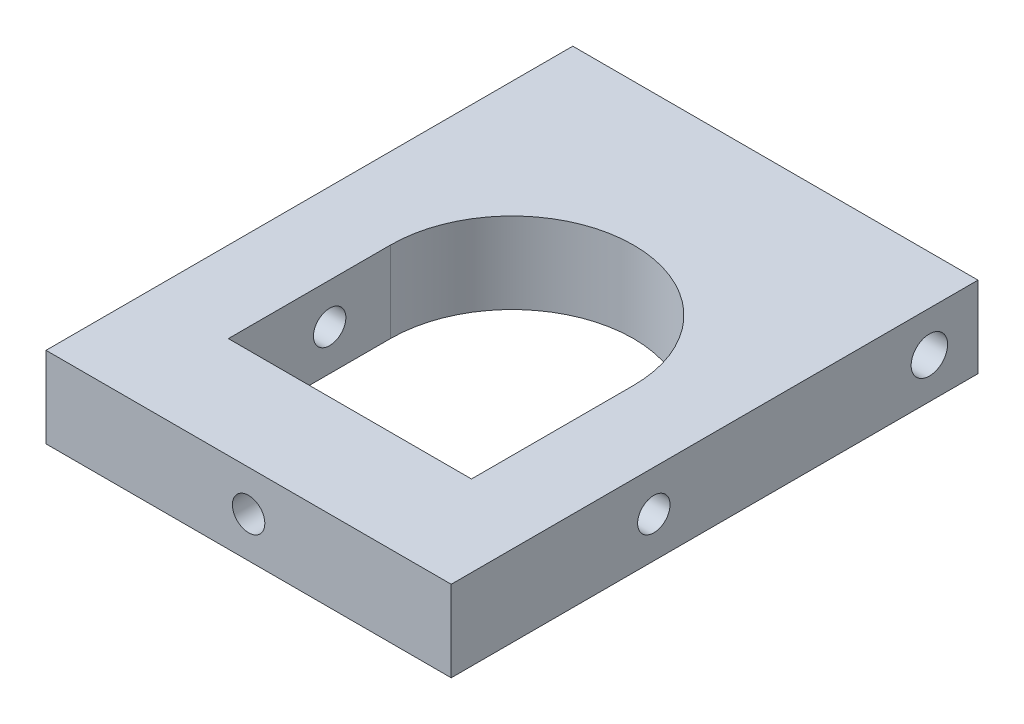
ISO-10303-21;
HEADER;
FILE_DESCRIPTION(('STEP AP214'),'2;1');
FILE_NAME('part.step','',(''),(''),'','','');
FILE_SCHEMA(('AUTOMOTIVE_DESIGN { 1 0 10303 214 1 1 1 1 }'));
ENDSEC;
DATA;
#1=APPLICATION_CONTEXT('core data for automotive mechanical design processes');
#2=APPLICATION_PROTOCOL_DEFINITION('international standard','automotive_design',2000,#1);
#3=PRODUCT_CONTEXT('',#1,'mechanical');
#4=PRODUCT('Part','Part','',(#3));
#5=PRODUCT_RELATED_PRODUCT_CATEGORY('part','',(#4));
#6=PRODUCT_DEFINITION_FORMATION('','',#4);
#7=PRODUCT_DEFINITION_CONTEXT('part definition',#1,'design');
#8=PRODUCT_DEFINITION('design','',#6,#7);
#9=PRODUCT_DEFINITION_SHAPE('','',#8);
#10=(LENGTH_UNIT() NAMED_UNIT(*) SI_UNIT(.MILLI.,.METRE.));
#11=(NAMED_UNIT(*) PLANE_ANGLE_UNIT() SI_UNIT($,.RADIAN.));
#12=(NAMED_UNIT(*) SI_UNIT($,.STERADIAN.) SOLID_ANGLE_UNIT());
#13=UNCERTAINTY_MEASURE_WITH_UNIT(LENGTH_MEASURE(1.E-05),#10,'distance_accuracy_value','');
#14=(GEOMETRIC_REPRESENTATION_CONTEXT(3) GLOBAL_UNCERTAINTY_ASSIGNED_CONTEXT((#13)) GLOBAL_UNIT_ASSIGNED_CONTEXT((#10,
#11,#12)) REPRESENTATION_CONTEXT('',''));
#15=CARTESIAN_POINT('',(0.,0.,0.));
#16=DIRECTION('',(0.,0.,1.));
#17=DIRECTION('',(1.,0.,0.));
#18=AXIS2_PLACEMENT_3D('',#15,#16,#17);
#19=CARTESIAN_POINT('',(0.,0.,0.));
#20=DIRECTION('',(0.,1.,0.));
#21=DIRECTION('',(0.,0.,1.));
#22=AXIS2_PLACEMENT_3D('',#19,#20,#21);
#23=PLANE('',#22);
#24=DIRECTION('',(0.,0.,1.));
#25=VECTOR('',#24,1.);
#26=CARTESIAN_POINT('',(-21.35,0.,3.74999999999999));
#27=LINE('',#26,#25);
#28=CARTESIAN_POINT('',(-21.35,0.,3.74999999999999));
#29=VERTEX_POINT('',#28);
#30=CARTESIAN_POINT('',(-21.35,0.,11.25));
#31=VERTEX_POINT('',#30);
#32=EDGE_CURVE('E57',#29,#31,#27,.T.);
#33=ORIENTED_EDGE('',*,*,#32,.T.);
#34=DIRECTION('',(1.,0.,0.));
#35=VECTOR('',#34,1.);
#36=CARTESIAN_POINT('',(-18.65,0.,11.25));
#37=LINE('',#36,#35);
#38=CARTESIAN_POINT('',(-18.65,0.,11.25));
#39=VERTEX_POINT('',#38);
#40=EDGE_CURVE('E213',#31,#39,#37,.T.);
#41=ORIENTED_EDGE('',*,*,#40,.T.);
#42=DIRECTION('',(0.,0.,-1.));
#43=VECTOR('',#42,1.);
#44=CARTESIAN_POINT('',(-18.65,0.,3.74999999999999));
#45=LINE('',#44,#43);
#46=CARTESIAN_POINT('',(-18.65,0.,3.74999999999999));
#47=VERTEX_POINT('',#46);
#48=EDGE_CURVE('E216',#39,#47,#45,.T.);
#49=ORIENTED_EDGE('',*,*,#48,.T.);
#50=DIRECTION('',(-1.,0.,0.));
#51=VECTOR('',#50,1.);
#52=CARTESIAN_POINT('',(-18.65,0.,3.74999999999999));
#53=LINE('',#52,#51);
#54=EDGE_CURVE('E205',#47,#29,#53,.T.);
#55=ORIENTED_EDGE('',*,*,#54,.T.);
#56=EDGE_LOOP('',(#33,#41,#49,#55));
#57=FACE_BOUND('',#56,.T.);
#58=CARTESIAN_POINT('',(0.,0.,0.));
#59=DIRECTION('',(0.,1.,0.));
#60=DIRECTION('',(0.,0.,1.));
#61=AXIS2_PLACEMENT_3D('',#58,#59,#60);
#62=CIRCLE('',#61,15.);
#63=CARTESIAN_POINT('',(15.,0.,0.));
#64=VERTEX_POINT('',#63);
#65=CARTESIAN_POINT('',(-15.,0.,0.));
#66=VERTEX_POINT('',#65);
#67=EDGE_CURVE('E283',#64,#66,#62,.T.);
#68=ORIENTED_EDGE('',*,*,#67,.T.);
#69=DIRECTION('',(0.,0.,1.));
#70=VECTOR('',#69,1.);
#71=CARTESIAN_POINT('',(-15.,0.,0.));
#72=LINE('',#71,#70);
#73=CARTESIAN_POINT('',(-15.,0.,20.));
#74=VERTEX_POINT('',#73);
#75=EDGE_CURVE('E297',#66,#74,#72,.T.);
#76=ORIENTED_EDGE('',*,*,#75,.T.);
#77=DIRECTION('',(1.,0.,0.));
#78=VECTOR('',#77,1.);
#79=CARTESIAN_POINT('',(-15.,0.,20.));
#80=LINE('',#79,#78);
#81=CARTESIAN_POINT('',(15.,0.,20.));
#82=VERTEX_POINT('',#81);
#83=EDGE_CURVE('E300',#74,#82,#80,.T.);
#84=ORIENTED_EDGE('',*,*,#83,.T.);
#85=DIRECTION('',(0.,0.,-1.));
#86=VECTOR('',#85,1.);
#87=CARTESIAN_POINT('',(15.,0.,20.));
#88=LINE('',#87,#86);
#89=EDGE_CURVE('E287',#82,#64,#88,.T.);
#90=ORIENTED_EDGE('',*,*,#89,.T.);
#91=EDGE_LOOP('',(#68,#76,#84,#90));
#92=FACE_BOUND('',#91,.T.);
#93=DIRECTION('',(0.,0.,-1.));
#94=VECTOR('',#93,1.);
#95=CARTESIAN_POINT('',(25.,0.,-32.5));
#96=LINE('',#95,#94);
#97=CARTESIAN_POINT('',(25.,0.,32.5));
#98=VERTEX_POINT('',#97);
#99=CARTESIAN_POINT('',(25.,0.,-32.5));
#100=VERTEX_POINT('',#99);
#101=EDGE_CURVE('E314',#98,#100,#96,.T.);
#102=ORIENTED_EDGE('',*,*,#101,.F.);
#103=DIRECTION('',(1.,0.,0.));
#104=VECTOR('',#103,1.);
#105=CARTESIAN_POINT('',(-25.,0.,32.5));
#106=LINE('',#105,#104);
#107=CARTESIAN_POINT('',(-25.,0.,32.5));
#108=VERTEX_POINT('',#107);
#109=EDGE_CURVE('E319',#108,#98,#106,.T.);
#110=ORIENTED_EDGE('',*,*,#109,.F.);
#111=DIRECTION('',(0.,0.,1.));
#112=VECTOR('',#111,1.);
#113=CARTESIAN_POINT('',(-25.,0.,-32.5));
#114=LINE('',#113,#112);
#115=CARTESIAN_POINT('',(-25.,0.,-32.5));
#116=VERTEX_POINT('',#115);
#117=EDGE_CURVE('E330',#116,#108,#114,.T.);
#118=ORIENTED_EDGE('',*,*,#117,.F.);
#119=DIRECTION('',(-1.,0.,0.));
#120=VECTOR('',#119,1.);
#121=CARTESIAN_POINT('',(-25.,0.,-32.5));
#122=LINE('',#121,#120);
#123=EDGE_CURVE('E328',#100,#116,#122,.T.);
#124=ORIENTED_EDGE('',*,*,#123,.F.);
#125=EDGE_LOOP('',(#102,#110,#118,#124));
#126=FACE_BOUND('',#125,.T.);
#127=DIRECTION('',(0.,0.,1.));
#128=VECTOR('',#127,1.);
#129=CARTESIAN_POINT('',(18.65,0.,3.74999999999999));
#130=LINE('',#129,#128);
#131=CARTESIAN_POINT('',(18.65,0.,3.74999999999999));
#132=VERTEX_POINT('',#131);
#133=CARTESIAN_POINT('',(18.65,0.,11.25));
#134=VERTEX_POINT('',#133);
#135=EDGE_CURVE('E240',#132,#134,#130,.T.);
#136=ORIENTED_EDGE('',*,*,#135,.T.);
#137=DIRECTION('',(1.,0.,0.));
#138=VECTOR('',#137,1.);
#139=CARTESIAN_POINT('',(21.35,0.,11.25));
#140=LINE('',#139,#138);
#141=CARTESIAN_POINT('',(21.35,0.,11.25));
#142=VERTEX_POINT('',#141);
#143=EDGE_CURVE('E243',#134,#142,#140,.T.);
#144=ORIENTED_EDGE('',*,*,#143,.T.);
#145=DIRECTION('',(0.,0.,-1.));
#146=VECTOR('',#145,1.);
#147=CARTESIAN_POINT('',(21.35,0.,3.74999999999999));
#148=LINE('',#147,#146);
#149=CARTESIAN_POINT('',(21.35,0.,3.74999999999999));
#150=VERTEX_POINT('',#149);
#151=EDGE_CURVE('E247',#142,#150,#148,.T.);
#152=ORIENTED_EDGE('',*,*,#151,.T.);
#153=DIRECTION('',(-1.,0.,0.));
#154=VECTOR('',#153,1.);
#155=CARTESIAN_POINT('',(21.35,0.,3.74999999999999));
#156=LINE('',#155,#154);
#157=EDGE_CURVE('E233',#150,#132,#156,.T.);
#158=ORIENTED_EDGE('',*,*,#157,.T.);
#159=EDGE_LOOP('',(#136,#144,#152,#158));
#160=FACE_BOUND('',#159,.T.);
#161=DIRECTION('',(0.,0.,1.));
#162=VECTOR('',#161,1.);
#163=CARTESIAN_POINT('',(-3.75000000000001,0.,24.9));
#164=LINE('',#163,#162);
#165=CARTESIAN_POINT('',(-3.75000000000001,0.,24.9));
#166=VERTEX_POINT('',#165);
#167=CARTESIAN_POINT('',(-3.75000000000001,0.,27.6));
#168=VERTEX_POINT('',#167);
#169=EDGE_CURVE('E49',#166,#168,#164,.T.);
#170=ORIENTED_EDGE('',*,*,#169,.T.);
#171=DIRECTION('',(1.,0.,0.));
#172=VECTOR('',#171,1.);
#173=CARTESIAN_POINT('',(3.74999999999999,0.,27.6));
#174=LINE('',#173,#172);
#175=CARTESIAN_POINT('',(3.74999999999999,0.,27.6));
#176=VERTEX_POINT('',#175);
#177=EDGE_CURVE('E192',#168,#176,#174,.T.);
#178=ORIENTED_EDGE('',*,*,#177,.T.);
#179=DIRECTION('',(0.,0.,-1.));
#180=VECTOR('',#179,1.);
#181=CARTESIAN_POINT('',(3.74999999999999,0.,24.9));
#182=LINE('',#181,#180);
#183=CARTESIAN_POINT('',(3.74999999999999,0.,24.9));
#184=VERTEX_POINT('',#183);
#185=EDGE_CURVE('E665',#176,#184,#182,.T.);
#186=ORIENTED_EDGE('',*,*,#185,.T.);
#187=DIRECTION('',(-1.,0.,0.));
#188=VECTOR('',#187,1.);
#189=CARTESIAN_POINT('',(3.74999999999999,0.,24.9));
#190=LINE('',#189,#188);
#191=EDGE_CURVE('E188',#184,#166,#190,.T.);
#192=ORIENTED_EDGE('',*,*,#191,.T.);
#193=EDGE_LOOP('',(#170,#178,#186,#192));
#194=FACE_BOUND('',#193,.T.);
#195=ADVANCED_FACE('F32',(#57,#92,#126,#160,#194),#23,.F.);
#196=CARTESIAN_POINT('',(0.,5.,32.5));
#197=DIRECTION('',(0.,0.,-1.));
#198=DIRECTION('',(-1.,0.,0.));
#199=AXIS2_PLACEMENT_3D('',#196,#197,#198);
#200=CYLINDRICAL_SURFACE('',#199,2.);
#201=CARTESIAN_POINT('',(0.,5.,32.5));
#202=DIRECTION('',(0.,0.,1.));
#203=DIRECTION('',(1.,0.,0.));
#204=AXIS2_PLACEMENT_3D('',#201,#202,#203);
#205=CIRCLE('',#204,2.);
#206=CARTESIAN_POINT('',(2.,5.,32.5));
#207=VERTEX_POINT('',#206);
#208=EDGE_CURVE('E262',#207,#207,#205,.T.);
#209=ORIENTED_EDGE('',*,*,#208,.T.);
#210=EDGE_LOOP('',(#209));
#211=FACE_BOUND('',#210,.T.);
#212=CARTESIAN_POINT('',(0.,5.,27.6));
#213=DIRECTION('',(0.,0.,-1.));
#214=DIRECTION('',(-1.,0.,0.));
#215=AXIS2_PLACEMENT_3D('',#212,#213,#214);
#216=CIRCLE('',#215,2.);
#217=CARTESIAN_POINT('',(-2.,5.,27.6));
#218=VERTEX_POINT('',#217);
#219=EDGE_CURVE('E36',#218,#218,#216,.T.);
#220=ORIENTED_EDGE('',*,*,#219,.T.);
#221=EDGE_LOOP('',(#220));
#222=FACE_BOUND('',#221,.T.);
#223=ADVANCED_FACE('F368',(#211,#222),#200,.F.);
#224=CARTESIAN_POINT('',(0.,5.,20.));
#225=DIRECTION('',(0.,0.,-1.));
#226=DIRECTION('',(-1.,0.,0.));
#227=AXIS2_PLACEMENT_3D('',#224,#225,#226);
#228=CIRCLE('',#227,2.);
#229=CARTESIAN_POINT('',(-2.,5.,20.));
#230=VERTEX_POINT('',#229);
#231=EDGE_CURVE('E265',#230,#230,#228,.F.);
#232=ORIENTED_EDGE('',*,*,#231,.F.);
#233=EDGE_LOOP('',(#232));
#234=FACE_BOUND('',#233,.T.);
#235=CARTESIAN_POINT('',(0.,5.,24.9));
#236=DIRECTION('',(0.,0.,1.));
#237=DIRECTION('',(1.,0.,0.));
#238=AXIS2_PLACEMENT_3D('',#235,#236,#237);
#239=CIRCLE('',#238,2.);
#240=CARTESIAN_POINT('',(2.,5.,24.9));
#241=VERTEX_POINT('',#240);
#242=EDGE_CURVE('E193',#241,#241,#239,.T.);
#243=ORIENTED_EDGE('',*,*,#242,.T.);
#244=EDGE_LOOP('',(#243));
#245=FACE_BOUND('',#244,.T.);
#246=ADVANCED_FACE('F358',(#234,#245),#200,.F.);
#247=CARTESIAN_POINT('',(-25.,5.,7.49999999999999));
#248=DIRECTION('',(1.,0.,0.));
#249=DIRECTION('',(0.,0.,-1.));
#250=AXIS2_PLACEMENT_3D('',#247,#248,#249);
#251=CYLINDRICAL_SURFACE('',#250,2.);
#252=CARTESIAN_POINT('',(-25.,5.,7.49999999999999));
#253=DIRECTION('',(1.,0.,0.));
#254=DIRECTION('',(0.,0.,-1.));
#255=AXIS2_PLACEMENT_3D('',#252,#253,#254);
#256=CIRCLE('',#255,2.);
#257=CARTESIAN_POINT('',(-25.,5.,5.49999999999999));
#258=VERTEX_POINT('',#257);
#259=EDGE_CURVE('E276',#258,#258,#256,.T.);
#260=ORIENTED_EDGE('',*,*,#259,.F.);
#261=EDGE_LOOP('',(#260));
#262=FACE_BOUND('',#261,.T.);
#263=CARTESIAN_POINT('',(-21.35,5.,7.49999999999999));
#264=DIRECTION('',(1.,0.,0.));
#265=DIRECTION('',(0.,0.,-1.));
#266=AXIS2_PLACEMENT_3D('',#263,#264,#265);
#267=CIRCLE('',#266,2.);
#268=CARTESIAN_POINT('',(-21.35,5.,5.49999999999999));
#269=VERTEX_POINT('',#268);
#270=EDGE_CURVE('E244',#269,#269,#267,.F.);
#271=ORIENTED_EDGE('',*,*,#270,.F.);
#272=EDGE_LOOP('',(#271));
#273=FACE_BOUND('',#272,.T.);
#274=ADVANCED_FACE('F355',(#262,#273),#251,.F.);
#275=CARTESIAN_POINT('',(-15.,5.,7.49999999999999));
#276=DIRECTION('',(1.,0.,0.));
#277=DIRECTION('',(0.,0.,-1.));
#278=AXIS2_PLACEMENT_3D('',#275,#276,#277);
#279=CIRCLE('',#278,2.);
#280=CARTESIAN_POINT('',(-15.,5.,5.49999999999999));
#281=VERTEX_POINT('',#280);
#282=EDGE_CURVE('E280',#281,#281,#279,.T.);
#283=ORIENTED_EDGE('',*,*,#282,.T.);
#284=EDGE_LOOP('',(#283));
#285=FACE_BOUND('',#284,.T.);
#286=CARTESIAN_POINT('',(-18.65,5.,7.49999999999999));
#287=DIRECTION('',(-1.,0.,0.));
#288=DIRECTION('',(0.,0.,1.));
#289=AXIS2_PLACEMENT_3D('',#286,#287,#288);
#290=CIRCLE('',#289,2.);
#291=CARTESIAN_POINT('',(-18.65,5.,9.49999999999999));
#292=VERTEX_POINT('',#291);
#293=EDGE_CURVE('E228',#292,#292,#290,.F.);
#294=ORIENTED_EDGE('',*,*,#293,.F.);
#295=EDGE_LOOP('',(#294));
#296=FACE_BOUND('',#295,.T.);
#297=ADVANCED_FACE('F357',(#285,#296),#251,.F.);
#298=CARTESIAN_POINT('',(15.,5.,7.49999999999999));
#299=DIRECTION('',(-1.,0.,0.));
#300=DIRECTION('',(0.,0.,1.));
#301=AXIS2_PLACEMENT_3D('',#298,#299,#300);
#302=CIRCLE('',#301,2.);
#303=CARTESIAN_POINT('',(15.,5.,9.49999999999999));
#304=VERTEX_POINT('',#303);
#305=EDGE_CURVE('E279',#304,#304,#302,.T.);
#306=ORIENTED_EDGE('',*,*,#305,.T.);
#307=EDGE_LOOP('',(#306));
#308=FACE_BOUND('',#307,.T.);
#309=CARTESIAN_POINT('',(18.65,5.,7.49999999999999));
#310=DIRECTION('',(1.,0.,0.));
#311=DIRECTION('',(0.,0.,-1.));
#312=AXIS2_PLACEMENT_3D('',#309,#310,#311);
#313=CIRCLE('',#312,2.);
#314=CARTESIAN_POINT('',(18.65,5.,5.49999999999999));
#315=VERTEX_POINT('',#314);
#316=EDGE_CURVE('E266',#315,#315,#313,.F.);
#317=ORIENTED_EDGE('',*,*,#316,.F.);
#318=EDGE_LOOP('',(#317));
#319=FACE_BOUND('',#318,.T.);
#320=ADVANCED_FACE('F361',(#308,#319),#251,.F.);
#321=CARTESIAN_POINT('',(25.,5.,7.49999999999999));
#322=DIRECTION('',(1.,0.,0.));
#323=DIRECTION('',(0.,0.,-1.));
#324=AXIS2_PLACEMENT_3D('',#321,#322,#323);
#325=CIRCLE('',#324,2.);
#326=CARTESIAN_POINT('',(25.,5.,5.49999999999999));
#327=VERTEX_POINT('',#326);
#328=EDGE_CURVE('E273',#327,#327,#325,.T.);
#329=ORIENTED_EDGE('',*,*,#328,.T.);
#330=EDGE_LOOP('',(#329));
#331=FACE_BOUND('',#330,.T.);
#332=CARTESIAN_POINT('',(21.35,5.,7.49999999999999));
#333=DIRECTION('',(-1.,0.,0.));
#334=DIRECTION('',(0.,0.,1.));
#335=AXIS2_PLACEMENT_3D('',#332,#333,#334);
#336=CIRCLE('',#335,2.);
#337=CARTESIAN_POINT('',(21.35,5.,9.49999999999999));
#338=VERTEX_POINT('',#337);
#339=EDGE_CURVE('E261',#338,#338,#336,.F.);
#340=ORIENTED_EDGE('',*,*,#339,.F.);
#341=EDGE_LOOP('',(#340));
#342=FACE_BOUND('',#341,.T.);
#343=ADVANCED_FACE('F367',(#331,#342),#251,.F.);
#344=CARTESIAN_POINT('',(0.,10.,0.));
#345=DIRECTION('',(0.,1.,0.));
#346=DIRECTION('',(0.,0.,1.));
#347=AXIS2_PLACEMENT_3D('',#344,#345,#346);
#348=PLANE('',#347);
#349=DIRECTION('',(0.,0.,-1.));
#350=VECTOR('',#349,1.);
#351=CARTESIAN_POINT('',(25.,10.,-32.5));
#352=LINE('',#351,#350);
#353=CARTESIAN_POINT('',(25.,10.,32.5));
#354=VERTEX_POINT('',#353);
#355=CARTESIAN_POINT('',(25.,10.,-32.5));
#356=VERTEX_POINT('',#355);
#357=EDGE_CURVE('E315',#354,#356,#352,.T.);
#358=ORIENTED_EDGE('',*,*,#357,.T.);
#359=DIRECTION('',(-1.,0.,0.));
#360=VECTOR('',#359,1.);
#361=CARTESIAN_POINT('',(-25.,10.,-32.5));
#362=LINE('',#361,#360);
#363=CARTESIAN_POINT('',(-25.,10.,-32.5));
#364=VERTEX_POINT('',#363);
#365=EDGE_CURVE('E318',#356,#364,#362,.T.);
#366=ORIENTED_EDGE('',*,*,#365,.T.);
#367=DIRECTION('',(0.,0.,1.));
#368=VECTOR('',#367,1.);
#369=CARTESIAN_POINT('',(-25.,10.,-32.5));
#370=LINE('',#369,#368);
#371=CARTESIAN_POINT('',(-25.,10.,32.5));
#372=VERTEX_POINT('',#371);
#373=EDGE_CURVE('E321',#364,#372,#370,.T.);
#374=ORIENTED_EDGE('',*,*,#373,.T.);
#375=DIRECTION('',(1.,0.,0.));
#376=VECTOR('',#375,1.);
#377=CARTESIAN_POINT('',(-25.,10.,32.5));
#378=LINE('',#377,#376);
#379=EDGE_CURVE('E323',#372,#354,#378,.T.);
#380=ORIENTED_EDGE('',*,*,#379,.T.);
#381=EDGE_LOOP('',(#358,#366,#374,#380));
#382=FACE_BOUND('',#381,.T.);
#383=DIRECTION('',(0.,0.,1.));
#384=VECTOR('',#383,1.);
#385=CARTESIAN_POINT('',(-15.,10.,0.));
#386=LINE('',#385,#384);
#387=CARTESIAN_POINT('',(-15.,10.,0.));
#388=VERTEX_POINT('',#387);
#389=CARTESIAN_POINT('',(-15.,10.,20.));
#390=VERTEX_POINT('',#389);
#391=EDGE_CURVE('E286',#388,#390,#386,.T.);
#392=ORIENTED_EDGE('',*,*,#391,.F.);
#393=CARTESIAN_POINT('',(0.,10.,0.));
#394=DIRECTION('',(0.,1.,0.));
#395=DIRECTION('',(0.,0.,1.));
#396=AXIS2_PLACEMENT_3D('',#393,#394,#395);
#397=CIRCLE('',#396,15.);
#398=CARTESIAN_POINT('',(15.,10.,0.));
#399=VERTEX_POINT('',#398);
#400=EDGE_CURVE('E284',#399,#388,#397,.T.);
#401=ORIENTED_EDGE('',*,*,#400,.F.);
#402=DIRECTION('',(0.,0.,-1.));
#403=VECTOR('',#402,1.);
#404=CARTESIAN_POINT('',(15.,10.,20.));
#405=LINE('',#404,#403);
#406=CARTESIAN_POINT('',(15.,10.,20.));
#407=VERTEX_POINT('',#406);
#408=EDGE_CURVE('E292',#407,#399,#405,.T.);
#409=ORIENTED_EDGE('',*,*,#408,.F.);
#410=DIRECTION('',(1.,0.,0.));
#411=VECTOR('',#410,1.);
#412=CARTESIAN_POINT('',(-15.,10.,20.));
#413=LINE('',#412,#411);
#414=EDGE_CURVE('E289',#390,#407,#413,.T.);
#415=ORIENTED_EDGE('',*,*,#414,.F.);
#416=EDGE_LOOP('',(#392,#401,#409,#415));
#417=FACE_BOUND('',#416,.T.);
#418=ADVANCED_FACE('F386',(#382,#417),#348,.T.);
#419=CARTESIAN_POINT('',(25.,10.,-32.5));
#420=DIRECTION('',(-1.,0.,0.));
#421=DIRECTION('',(0.,0.,1.));
#422=AXIS2_PLACEMENT_3D('',#419,#420,#421);
#423=PLANE('',#422);
#424=CARTESIAN_POINT('',(25.,5.,-26.5));
#425=DIRECTION('',(1.,0.,0.));
#426=DIRECTION('',(0.,0.,-1.));
#427=AXIS2_PLACEMENT_3D('',#424,#425,#426);
#428=CIRCLE('',#427,2.25);
#429=CARTESIAN_POINT('',(25.,5.,-28.75));
#430=VERTEX_POINT('',#429);
#431=EDGE_CURVE('E267',#430,#430,#428,.T.);
#432=ORIENTED_EDGE('',*,*,#431,.F.);
#433=EDGE_LOOP('',(#432));
#434=FACE_BOUND('',#433,.T.);
#435=ORIENTED_EDGE('',*,*,#328,.F.);
#436=EDGE_LOOP('',(#435));
#437=FACE_BOUND('',#436,.T.);
#438=ORIENTED_EDGE('',*,*,#101,.T.);
#439=DIRECTION('',(0.,-1.,0.));
#440=VECTOR('',#439,1.);
#441=CARTESIAN_POINT('',(25.,10.,-32.5));
#442=LINE('',#441,#440);
#443=EDGE_CURVE('E11',#356,#100,#442,.T.);
#444=ORIENTED_EDGE('',*,*,#443,.F.);
#445=ORIENTED_EDGE('',*,*,#357,.F.);
#446=DIRECTION('',(0.,-1.,0.));
#447=VECTOR('',#446,1.);
#448=CARTESIAN_POINT('',(25.,10.,32.5));
#449=LINE('',#448,#447);
#450=EDGE_CURVE('E325',#354,#98,#449,.T.);
#451=ORIENTED_EDGE('',*,*,#450,.T.);
#452=EDGE_LOOP('',(#438,#444,#445,#451));
#453=FACE_BOUND('',#452,.T.);
#454=ADVANCED_FACE('F34',(#434,#437,#453),#423,.F.);
#455=CARTESIAN_POINT('',(-25.,10.,-32.5));
#456=DIRECTION('',(0.,0.,1.));
#457=DIRECTION('',(1.,0.,0.));
#458=AXIS2_PLACEMENT_3D('',#455,#456,#457);
#459=PLANE('',#458);
#460=ORIENTED_EDGE('',*,*,#123,.T.);
#461=DIRECTION('',(0.,-1.,0.));
#462=VECTOR('',#461,1.);
#463=CARTESIAN_POINT('',(-25.,10.,-32.5));
#464=LINE('',#463,#462);
#465=EDGE_CURVE('E41',#364,#116,#464,.T.);
#466=ORIENTED_EDGE('',*,*,#465,.F.);
#467=ORIENTED_EDGE('',*,*,#365,.F.);
#468=ORIENTED_EDGE('',*,*,#443,.T.);
#469=EDGE_LOOP('',(#460,#466,#467,#468));
#470=FACE_BOUND('',#469,.T.);
#471=ADVANCED_FACE('F395',(#470),#459,.F.);
#472=CARTESIAN_POINT('',(-25.,10.,-32.5));
#473=DIRECTION('',(1.,0.,0.));
#474=DIRECTION('',(0.,0.,-1.));
#475=AXIS2_PLACEMENT_3D('',#472,#473,#474);
#476=PLANE('',#475);
#477=CARTESIAN_POINT('',(-25.,5.,-26.5));
#478=DIRECTION('',(1.,0.,0.));
#479=DIRECTION('',(0.,0.,-1.));
#480=AXIS2_PLACEMENT_3D('',#477,#478,#479);
#481=CIRCLE('',#480,2.25);
#482=CARTESIAN_POINT('',(-25.,5.,-28.75));
#483=VERTEX_POINT('',#482);
#484=EDGE_CURVE('E270',#483,#483,#481,.T.);
#485=ORIENTED_EDGE('',*,*,#484,.T.);
#486=EDGE_LOOP('',(#485));
#487=FACE_BOUND('',#486,.T.);
#488=ORIENTED_EDGE('',*,*,#259,.T.);
#489=EDGE_LOOP('',(#488));
#490=FACE_BOUND('',#489,.T.);
#491=ORIENTED_EDGE('',*,*,#117,.T.);
#492=DIRECTION('',(0.,-1.,0.));
#493=VECTOR('',#492,1.);
#494=CARTESIAN_POINT('',(-25.,10.,32.5));
#495=LINE('',#494,#493);
#496=EDGE_CURVE('E335',#372,#108,#495,.T.);
#497=ORIENTED_EDGE('',*,*,#496,.F.);
#498=ORIENTED_EDGE('',*,*,#373,.F.);
#499=ORIENTED_EDGE('',*,*,#465,.T.);
#500=EDGE_LOOP('',(#491,#497,#498,#499));
#501=FACE_BOUND('',#500,.T.);
#502=ADVANCED_FACE('F392',(#487,#490,#501),#476,.F.);
#503=CARTESIAN_POINT('',(-25.,10.,32.5));
#504=DIRECTION('',(0.,0.,-1.));
#505=DIRECTION('',(-1.,0.,0.));
#506=AXIS2_PLACEMENT_3D('',#503,#504,#505);
#507=PLANE('',#506);
#508=ORIENTED_EDGE('',*,*,#208,.F.);
#509=EDGE_LOOP('',(#508));
#510=FACE_BOUND('',#509,.T.);
#511=ORIENTED_EDGE('',*,*,#109,.T.);
#512=ORIENTED_EDGE('',*,*,#450,.F.);
#513=ORIENTED_EDGE('',*,*,#379,.F.);
#514=ORIENTED_EDGE('',*,*,#496,.T.);
#515=EDGE_LOOP('',(#511,#512,#513,#514));
#516=FACE_BOUND('',#515,.T.);
#517=ADVANCED_FACE('F388',(#510,#516),#507,.F.);
#518=CARTESIAN_POINT('',(0.,10.,0.));
#519=DIRECTION('',(0.,-1.,0.));
#520=DIRECTION('',(0.,0.,-1.));
#521=AXIS2_PLACEMENT_3D('',#518,#519,#520);
#522=CYLINDRICAL_SURFACE('',#521,15.);
#523=ORIENTED_EDGE('',*,*,#67,.F.);
#524=DIRECTION('',(0.,-1.,0.));
#525=VECTOR('',#524,1.);
#526=CARTESIAN_POINT('',(15.,10.,0.));
#527=LINE('',#526,#525);
#528=EDGE_CURVE('E294',#399,#64,#527,.T.);
#529=ORIENTED_EDGE('',*,*,#528,.F.);
#530=ORIENTED_EDGE('',*,*,#400,.T.);
#531=DIRECTION('',(0.,-1.,0.));
#532=VECTOR('',#531,1.);
#533=CARTESIAN_POINT('',(-15.,10.,0.));
#534=LINE('',#533,#532);
#535=EDGE_CURVE('E311',#388,#66,#534,.T.);
#536=ORIENTED_EDGE('',*,*,#535,.T.);
#537=EDGE_LOOP('',(#523,#529,#530,#536));
#538=FACE_BOUND('',#537,.T.);
#539=ADVANCED_FACE('F391',(#538),#522,.F.);
#540=CARTESIAN_POINT('',(-15.,10.,0.));
#541=DIRECTION('',(1.,0.,0.));
#542=DIRECTION('',(0.,0.,-1.));
#543=AXIS2_PLACEMENT_3D('',#540,#541,#542);
#544=PLANE('',#543);
#545=ORIENTED_EDGE('',*,*,#282,.F.);
#546=EDGE_LOOP('',(#545));
#547=FACE_BOUND('',#546,.T.);
#548=ORIENTED_EDGE('',*,*,#75,.F.);
#549=ORIENTED_EDGE('',*,*,#535,.F.);
#550=ORIENTED_EDGE('',*,*,#391,.T.);
#551=DIRECTION('',(0.,-1.,0.));
#552=VECTOR('',#551,1.);
#553=CARTESIAN_POINT('',(-15.,10.,20.));
#554=LINE('',#553,#552);
#555=EDGE_CURVE('E309',#390,#74,#554,.T.);
#556=ORIENTED_EDGE('',*,*,#555,.T.);
#557=EDGE_LOOP('',(#548,#549,#550,#556));
#558=FACE_BOUND('',#557,.T.);
#559=ADVANCED_FACE('F428',(#547,#558),#544,.T.);
#560=CARTESIAN_POINT('',(-15.,10.,20.));
#561=DIRECTION('',(0.,0.,-1.));
#562=DIRECTION('',(-1.,0.,0.));
#563=AXIS2_PLACEMENT_3D('',#560,#561,#562);
#564=PLANE('',#563);
#565=ORIENTED_EDGE('',*,*,#231,.T.);
#566=EDGE_LOOP('',(#565));
#567=FACE_BOUND('',#566,.T.);
#568=ORIENTED_EDGE('',*,*,#83,.F.);
#569=ORIENTED_EDGE('',*,*,#555,.F.);
#570=ORIENTED_EDGE('',*,*,#414,.T.);
#571=DIRECTION('',(0.,-1.,0.));
#572=VECTOR('',#571,1.);
#573=CARTESIAN_POINT('',(15.,10.,20.));
#574=LINE('',#573,#572);
#575=EDGE_CURVE('E307',#407,#82,#574,.T.);
#576=ORIENTED_EDGE('',*,*,#575,.T.);
#577=EDGE_LOOP('',(#568,#569,#570,#576));
#578=FACE_BOUND('',#577,.T.);
#579=ADVANCED_FACE('F431',(#567,#578),#564,.T.);
#580=CARTESIAN_POINT('',(15.,10.,20.));
#581=DIRECTION('',(-1.,0.,0.));
#582=DIRECTION('',(0.,0.,1.));
#583=AXIS2_PLACEMENT_3D('',#580,#581,#582);
#584=PLANE('',#583);
#585=ORIENTED_EDGE('',*,*,#305,.F.);
#586=EDGE_LOOP('',(#585));
#587=FACE_BOUND('',#586,.T.);
#588=ORIENTED_EDGE('',*,*,#89,.F.);
#589=ORIENTED_EDGE('',*,*,#575,.F.);
#590=ORIENTED_EDGE('',*,*,#408,.T.);
#591=ORIENTED_EDGE('',*,*,#528,.T.);
#592=EDGE_LOOP('',(#588,#589,#590,#591));
#593=FACE_BOUND('',#592,.T.);
#594=ADVANCED_FACE('F436',(#587,#593),#584,.T.);
#595=CARTESIAN_POINT('',(-25.,5.,-26.5));
#596=DIRECTION('',(1.,0.,0.));
#597=DIRECTION('',(0.,0.,-1.));
#598=AXIS2_PLACEMENT_3D('',#595,#596,#597);
#599=CYLINDRICAL_SURFACE('',#598,2.25);
#600=ORIENTED_EDGE('',*,*,#484,.F.);
#601=EDGE_LOOP('',(#600));
#602=FACE_BOUND('',#601,.T.);
#603=ORIENTED_EDGE('',*,*,#431,.T.);
#604=EDGE_LOOP('',(#603));
#605=FACE_BOUND('',#604,.T.);
#606=ADVANCED_FACE('F438',(#602,#605),#599,.F.);
#607=CARTESIAN_POINT('',(18.65,8.75,3.74999999999999));
#608=DIRECTION('',(1.,0.,0.));
#609=DIRECTION('',(0.,0.,-1.));
#610=AXIS2_PLACEMENT_3D('',#607,#608,#609);
#611=PLANE('',#610);
#612=ORIENTED_EDGE('',*,*,#135,.F.);
#613=DIRECTION('',(0.,-1.,0.));
#614=VECTOR('',#613,1.);
#615=CARTESIAN_POINT('',(18.65,8.75,3.74999999999999));
#616=LINE('',#615,#614);
#617=CARTESIAN_POINT('',(18.65,8.75,3.74999999999999));
#618=VERTEX_POINT('',#617);
#619=EDGE_CURVE('E239',#618,#132,#616,.T.);
#620=ORIENTED_EDGE('',*,*,#619,.F.);
#621=DIRECTION('',(0.,0.,1.));
#622=VECTOR('',#621,1.);
#623=CARTESIAN_POINT('',(18.65,8.75,3.74999999999999));
#624=LINE('',#623,#622);
#625=CARTESIAN_POINT('',(18.65,8.75,11.25));
#626=VERTEX_POINT('',#625);
#627=EDGE_CURVE('E229',#618,#626,#624,.T.);
#628=ORIENTED_EDGE('',*,*,#627,.T.);
#629=DIRECTION('',(0.,-1.,0.));
#630=VECTOR('',#629,1.);
#631=CARTESIAN_POINT('',(18.65,8.75,11.25));
#632=LINE('',#631,#630);
#633=EDGE_CURVE('E258',#626,#134,#632,.T.);
#634=ORIENTED_EDGE('',*,*,#633,.T.);
#635=EDGE_LOOP('',(#612,#620,#628,#634));
#636=FACE_BOUND('',#635,.T.);
#637=ORIENTED_EDGE('',*,*,#316,.T.);
#638=EDGE_LOOP('',(#637));
#639=FACE_BOUND('',#638,.T.);
#640=ADVANCED_FACE('F444',(#636,#639),#611,.T.);
#641=CARTESIAN_POINT('',(21.35,8.75,3.74999999999999));
#642=DIRECTION('',(-1.,0.,0.));
#643=DIRECTION('',(0.,0.,1.));
#644=AXIS2_PLACEMENT_3D('',#641,#642,#643);
#645=PLANE('',#644);
#646=ORIENTED_EDGE('',*,*,#151,.F.);
#647=DIRECTION('',(0.,-1.,0.));
#648=VECTOR('',#647,1.);
#649=CARTESIAN_POINT('',(21.35,8.75,11.25));
#650=LINE('',#649,#648);
#651=CARTESIAN_POINT('',(21.35,8.75,11.25));
#652=VERTEX_POINT('',#651);
#653=EDGE_CURVE('E256',#652,#142,#650,.T.);
#654=ORIENTED_EDGE('',*,*,#653,.F.);
#655=DIRECTION('',(0.,0.,-1.));
#656=VECTOR('',#655,1.);
#657=CARTESIAN_POINT('',(21.35,8.75,3.74999999999999));
#658=LINE('',#657,#656);
#659=CARTESIAN_POINT('',(21.35,8.75,3.74999999999999));
#660=VERTEX_POINT('',#659);
#661=EDGE_CURVE('E235',#652,#660,#658,.T.);
#662=ORIENTED_EDGE('',*,*,#661,.T.);
#663=DIRECTION('',(0.,-1.,0.));
#664=VECTOR('',#663,1.);
#665=CARTESIAN_POINT('',(21.35,8.75,3.74999999999999));
#666=LINE('',#665,#664);
#667=EDGE_CURVE('E254',#660,#150,#666,.T.);
#668=ORIENTED_EDGE('',*,*,#667,.T.);
#669=EDGE_LOOP('',(#646,#654,#662,#668));
#670=FACE_BOUND('',#669,.T.);
#671=ORIENTED_EDGE('',*,*,#339,.T.);
#672=EDGE_LOOP('',(#671));
#673=FACE_BOUND('',#672,.T.);
#674=ADVANCED_FACE('F521',(#670,#673),#645,.T.);
#675=CARTESIAN_POINT('',(21.35,8.75,11.25));
#676=DIRECTION('',(0.,0.,-1.));
#677=DIRECTION('',(-1.,0.,0.));
#678=AXIS2_PLACEMENT_3D('',#675,#676,#677);
#679=PLANE('',#678);
#680=ORIENTED_EDGE('',*,*,#143,.F.);
#681=ORIENTED_EDGE('',*,*,#633,.F.);
#682=DIRECTION('',(1.,0.,0.));
#683=VECTOR('',#682,1.);
#684=CARTESIAN_POINT('',(21.35,8.75,11.25));
#685=LINE('',#684,#683);
#686=EDGE_CURVE('E232',#626,#652,#685,.T.);
#687=ORIENTED_EDGE('',*,*,#686,.T.);
#688=ORIENTED_EDGE('',*,*,#653,.T.);
#689=EDGE_LOOP('',(#680,#681,#687,#688));
#690=FACE_BOUND('',#689,.T.);
#691=ADVANCED_FACE('F531',(#690),#679,.T.);
#692=CARTESIAN_POINT('',(21.35,8.75,3.74999999999999));
#693=DIRECTION('',(0.,0.,1.));
#694=DIRECTION('',(1.,0.,0.));
#695=AXIS2_PLACEMENT_3D('',#692,#693,#694);
#696=PLANE('',#695);
#697=ORIENTED_EDGE('',*,*,#157,.F.);
#698=ORIENTED_EDGE('',*,*,#667,.F.);
#699=DIRECTION('',(-1.,0.,0.));
#700=VECTOR('',#699,1.);
#701=CARTESIAN_POINT('',(21.35,8.75,3.74999999999999));
#702=LINE('',#701,#700);
#703=EDGE_CURVE('E237',#660,#618,#702,.T.);
#704=ORIENTED_EDGE('',*,*,#703,.T.);
#705=ORIENTED_EDGE('',*,*,#619,.T.);
#706=EDGE_LOOP('',(#697,#698,#704,#705));
#707=FACE_BOUND('',#706,.T.);
#708=ADVANCED_FACE('F541',(#707),#696,.T.);
#709=CARTESIAN_POINT('',(0.,8.75,0.));
#710=DIRECTION('',(0.,-1.,0.));
#711=DIRECTION('',(0.,0.,-1.));
#712=AXIS2_PLACEMENT_3D('',#709,#710,#711);
#713=PLANE('',#712);
#714=ORIENTED_EDGE('',*,*,#627,.F.);
#715=ORIENTED_EDGE('',*,*,#703,.F.);
#716=ORIENTED_EDGE('',*,*,#661,.F.);
#717=ORIENTED_EDGE('',*,*,#686,.F.);
#718=EDGE_LOOP('',(#714,#715,#716,#717));
#719=FACE_BOUND('',#718,.T.);
#720=ADVANCED_FACE('F551',(#719),#713,.T.);
#721=CARTESIAN_POINT('',(-21.35,8.75,3.74999999999999));
#722=DIRECTION('',(1.,0.,0.));
#723=DIRECTION('',(0.,0.,-1.));
#724=AXIS2_PLACEMENT_3D('',#721,#722,#723);
#725=PLANE('',#724);
#726=ORIENTED_EDGE('',*,*,#32,.F.);
#727=DIRECTION('',(0.,-1.,0.));
#728=VECTOR('',#727,1.);
#729=CARTESIAN_POINT('',(-21.35,8.75,3.74999999999999));
#730=LINE('',#729,#728);
#731=CARTESIAN_POINT('',(-21.35,8.75,3.74999999999999));
#732=VERTEX_POINT('',#731);
#733=EDGE_CURVE('E211',#732,#29,#730,.T.);
#734=ORIENTED_EDGE('',*,*,#733,.F.);
#735=DIRECTION('',(0.,0.,1.));
#736=VECTOR('',#735,1.);
#737=CARTESIAN_POINT('',(-21.35,8.75,3.74999999999999));
#738=LINE('',#737,#736);
#739=CARTESIAN_POINT('',(-21.35,8.75,11.25));
#740=VERTEX_POINT('',#739);
#741=EDGE_CURVE('E201',#732,#740,#738,.T.);
#742=ORIENTED_EDGE('',*,*,#741,.T.);
#743=DIRECTION('',(0.,-1.,0.));
#744=VECTOR('',#743,1.);
#745=CARTESIAN_POINT('',(-21.35,8.75,11.25));
#746=LINE('',#745,#744);
#747=EDGE_CURVE('E226',#740,#31,#746,.T.);
#748=ORIENTED_EDGE('',*,*,#747,.T.);
#749=EDGE_LOOP('',(#726,#734,#742,#748));
#750=FACE_BOUND('',#749,.T.);
#751=ORIENTED_EDGE('',*,*,#270,.T.);
#752=EDGE_LOOP('',(#751));
#753=FACE_BOUND('',#752,.T.);
#754=ADVANCED_FACE('F353',(#750,#753),#725,.T.);
#755=CARTESIAN_POINT('',(-18.65,8.75,3.74999999999999));
#756=DIRECTION('',(-1.,0.,0.));
#757=DIRECTION('',(0.,0.,1.));
#758=AXIS2_PLACEMENT_3D('',#755,#756,#757);
#759=PLANE('',#758);
#760=ORIENTED_EDGE('',*,*,#48,.F.);
#761=DIRECTION('',(0.,-1.,0.));
#762=VECTOR('',#761,1.);
#763=CARTESIAN_POINT('',(-18.65,8.75,11.25));
#764=LINE('',#763,#762);
#765=CARTESIAN_POINT('',(-18.65,8.75,11.25));
#766=VERTEX_POINT('',#765);
#767=EDGE_CURVE('E224',#766,#39,#764,.T.);
#768=ORIENTED_EDGE('',*,*,#767,.F.);
#769=DIRECTION('',(0.,0.,-1.));
#770=VECTOR('',#769,1.);
#771=CARTESIAN_POINT('',(-18.65,8.75,3.74999999999999));
#772=LINE('',#771,#770);
#773=CARTESIAN_POINT('',(-18.65,8.75,3.74999999999999));
#774=VERTEX_POINT('',#773);
#775=EDGE_CURVE('E207',#766,#774,#772,.T.);
#776=ORIENTED_EDGE('',*,*,#775,.T.);
#777=DIRECTION('',(0.,-1.,0.));
#778=VECTOR('',#777,1.);
#779=CARTESIAN_POINT('',(-18.65,8.75,3.74999999999999));
#780=LINE('',#779,#778);
#781=EDGE_CURVE('E222',#774,#47,#780,.T.);
#782=ORIENTED_EDGE('',*,*,#781,.T.);
#783=EDGE_LOOP('',(#760,#768,#776,#782));
#784=FACE_BOUND('',#783,.T.);
#785=ORIENTED_EDGE('',*,*,#293,.T.);
#786=EDGE_LOOP('',(#785));
#787=FACE_BOUND('',#786,.T.);
#788=ADVANCED_FACE('F570',(#784,#787),#759,.T.);
#789=CARTESIAN_POINT('',(-18.65,8.75,11.25));
#790=DIRECTION('',(0.,0.,-1.));
#791=DIRECTION('',(-1.,0.,0.));
#792=AXIS2_PLACEMENT_3D('',#789,#790,#791);
#793=PLANE('',#792);
#794=ORIENTED_EDGE('',*,*,#40,.F.);
#795=ORIENTED_EDGE('',*,*,#747,.F.);
#796=DIRECTION('',(1.,0.,0.));
#797=VECTOR('',#796,1.);
#798=CARTESIAN_POINT('',(-18.65,8.75,11.25));
#799=LINE('',#798,#797);
#800=EDGE_CURVE('E204',#740,#766,#799,.T.);
#801=ORIENTED_EDGE('',*,*,#800,.T.);
#802=ORIENTED_EDGE('',*,*,#767,.T.);
#803=EDGE_LOOP('',(#794,#795,#801,#802));
#804=FACE_BOUND('',#803,.T.);
#805=ADVANCED_FACE('F579',(#804),#793,.T.);
#806=CARTESIAN_POINT('',(-18.65,8.75,3.74999999999999));
#807=DIRECTION('',(0.,0.,1.));
#808=DIRECTION('',(1.,0.,0.));
#809=AXIS2_PLACEMENT_3D('',#806,#807,#808);
#810=PLANE('',#809);
#811=ORIENTED_EDGE('',*,*,#54,.F.);
#812=ORIENTED_EDGE('',*,*,#781,.F.);
#813=DIRECTION('',(-1.,0.,0.));
#814=VECTOR('',#813,1.);
#815=CARTESIAN_POINT('',(-18.65,8.75,3.74999999999999));
#816=LINE('',#815,#814);
#817=EDGE_CURVE('E209',#774,#732,#816,.T.);
#818=ORIENTED_EDGE('',*,*,#817,.T.);
#819=ORIENTED_EDGE('',*,*,#733,.T.);
#820=EDGE_LOOP('',(#811,#812,#818,#819));
#821=FACE_BOUND('',#820,.T.);
#822=ADVANCED_FACE('F589',(#821),#810,.T.);
#823=CARTESIAN_POINT('',(0.,8.75,0.));
#824=DIRECTION('',(0.,-1.,0.));
#825=DIRECTION('',(0.,0.,-1.));
#826=AXIS2_PLACEMENT_3D('',#823,#824,#825);
#827=PLANE('',#826);
#828=ORIENTED_EDGE('',*,*,#741,.F.);
#829=ORIENTED_EDGE('',*,*,#817,.F.);
#830=ORIENTED_EDGE('',*,*,#775,.F.);
#831=ORIENTED_EDGE('',*,*,#800,.F.);
#832=EDGE_LOOP('',(#828,#829,#830,#831));
#833=FACE_BOUND('',#832,.T.);
#834=ADVANCED_FACE('F599',(#833),#827,.T.);
#835=CARTESIAN_POINT('',(-3.75000000000001,8.75,24.9));
#836=DIRECTION('',(1.,0.,0.));
#837=DIRECTION('',(0.,0.,-1.));
#838=AXIS2_PLACEMENT_3D('',#835,#836,#837);
#839=PLANE('',#838);
#840=ORIENTED_EDGE('',*,*,#169,.F.);
#841=DIRECTION('',(0.,-1.,0.));
#842=VECTOR('',#841,1.);
#843=CARTESIAN_POINT('',(-3.75000000000001,8.75,24.9));
#844=LINE('',#843,#842);
#845=CARTESIAN_POINT('',(-3.75000000000001,8.75,24.9));
#846=VERTEX_POINT('',#845);
#847=EDGE_CURVE('E187',#846,#166,#844,.T.);
#848=ORIENTED_EDGE('',*,*,#847,.F.);
#849=DIRECTION('',(0.,0.,1.));
#850=VECTOR('',#849,1.);
#851=CARTESIAN_POINT('',(-3.75000000000001,8.75,24.9));
#852=LINE('',#851,#850);
#853=CARTESIAN_POINT('',(-3.75000000000001,8.75,27.6));
#854=VERTEX_POINT('',#853);
#855=EDGE_CURVE('E179',#846,#854,#852,.T.);
#856=ORIENTED_EDGE('',*,*,#855,.T.);
#857=DIRECTION('',(0.,-1.,0.));
#858=VECTOR('',#857,1.);
#859=CARTESIAN_POINT('',(-3.75000000000001,8.75,27.6));
#860=LINE('',#859,#858);
#861=EDGE_CURVE('E186',#854,#168,#860,.T.);
#862=ORIENTED_EDGE('',*,*,#861,.T.);
#863=EDGE_LOOP('',(#840,#848,#856,#862));
#864=FACE_BOUND('',#863,.T.);
#865=ADVANCED_FACE('F185',(#864),#839,.T.);
#866=CARTESIAN_POINT('',(3.74999999999999,8.75,27.6));
#867=DIRECTION('',(0.,0.,-1.));
#868=DIRECTION('',(-1.,0.,0.));
#869=AXIS2_PLACEMENT_3D('',#866,#867,#868);
#870=PLANE('',#869);
#871=ORIENTED_EDGE('',*,*,#219,.F.);
#872=EDGE_LOOP('',(#871));
#873=FACE_BOUND('',#872,.T.);
#874=ORIENTED_EDGE('',*,*,#177,.F.);
#875=ORIENTED_EDGE('',*,*,#861,.F.);
#876=DIRECTION('',(1.,0.,0.));
#877=VECTOR('',#876,1.);
#878=CARTESIAN_POINT('',(3.74999999999999,8.75,27.6));
#879=LINE('',#878,#877);
#880=CARTESIAN_POINT('',(3.74999999999999,8.75,27.6));
#881=VERTEX_POINT('',#880);
#882=EDGE_CURVE('E175',#854,#881,#879,.T.);
#883=ORIENTED_EDGE('',*,*,#882,.T.);
#884=DIRECTION('',(0.,-1.,0.));
#885=VECTOR('',#884,1.);
#886=CARTESIAN_POINT('',(3.74999999999999,8.75,27.6));
#887=LINE('',#886,#885);
#888=EDGE_CURVE('E194',#881,#176,#887,.T.);
#889=ORIENTED_EDGE('',*,*,#888,.T.);
#890=EDGE_LOOP('',(#874,#875,#883,#889));
#891=FACE_BOUND('',#890,.T.);
#892=ADVANCED_FACE('F190',(#873,#891),#870,.T.);
#893=CARTESIAN_POINT('',(3.74999999999999,8.75,24.9));
#894=DIRECTION('',(-1.,0.,0.));
#895=DIRECTION('',(0.,0.,1.));
#896=AXIS2_PLACEMENT_3D('',#893,#894,#895);
#897=PLANE('',#896);
#898=ORIENTED_EDGE('',*,*,#185,.F.);
#899=ORIENTED_EDGE('',*,*,#888,.F.);
#900=DIRECTION('',(0.,0.,-1.));
#901=VECTOR('',#900,1.);
#902=CARTESIAN_POINT('',(3.74999999999999,8.75,24.9));
#903=LINE('',#902,#901);
#904=CARTESIAN_POINT('',(3.74999999999999,8.75,24.9));
#905=VERTEX_POINT('',#904);
#906=EDGE_CURVE('E180',#881,#905,#903,.T.);
#907=ORIENTED_EDGE('',*,*,#906,.T.);
#908=DIRECTION('',(0.,-1.,0.));
#909=VECTOR('',#908,1.);
#910=CARTESIAN_POINT('',(3.74999999999999,8.75,24.9));
#911=LINE('',#910,#909);
#912=EDGE_CURVE('E197',#905,#184,#911,.T.);
#913=ORIENTED_EDGE('',*,*,#912,.T.);
#914=EDGE_LOOP('',(#898,#899,#907,#913));
#915=FACE_BOUND('',#914,.T.);
#916=ADVANCED_FACE('F626',(#915),#897,.T.);
#917=CARTESIAN_POINT('',(3.74999999999999,8.75,24.9));
#918=DIRECTION('',(0.,0.,1.));
#919=DIRECTION('',(1.,0.,0.));
#920=AXIS2_PLACEMENT_3D('',#917,#918,#919);
#921=PLANE('',#920);
#922=ORIENTED_EDGE('',*,*,#242,.F.);
#923=EDGE_LOOP('',(#922));
#924=FACE_BOUND('',#923,.T.);
#925=ORIENTED_EDGE('',*,*,#191,.F.);
#926=ORIENTED_EDGE('',*,*,#912,.F.);
#927=DIRECTION('',(-1.,0.,0.));
#928=VECTOR('',#927,1.);
#929=CARTESIAN_POINT('',(3.74999999999999,8.75,24.9));
#930=LINE('',#929,#928);
#931=EDGE_CURVE('E672',#905,#846,#930,.T.);
#932=ORIENTED_EDGE('',*,*,#931,.T.);
#933=ORIENTED_EDGE('',*,*,#847,.T.);
#934=EDGE_LOOP('',(#925,#926,#932,#933));
#935=FACE_BOUND('',#934,.T.);
#936=ADVANCED_FACE('F636',(#924,#935),#921,.T.);
#937=CARTESIAN_POINT('',(0.,8.75,0.));
#938=DIRECTION('',(0.,-1.,0.));
#939=DIRECTION('',(0.,0.,-1.));
#940=AXIS2_PLACEMENT_3D('',#937,#938,#939);
#941=PLANE('',#940);
#942=ORIENTED_EDGE('',*,*,#855,.F.);
#943=ORIENTED_EDGE('',*,*,#931,.F.);
#944=ORIENTED_EDGE('',*,*,#906,.F.);
#945=ORIENTED_EDGE('',*,*,#882,.F.);
#946=EDGE_LOOP('',(#942,#943,#944,#945));
#947=FACE_BOUND('',#946,.T.);
#948=ADVANCED_FACE('F177',(#947),#941,.T.);
#949=CLOSED_SHELL('',(#195,#223,#246,#274,#297,#320,#343,#418,#454,#471,#502,#517,#539,#559,
#579,#594,#606,#640,#674,#691,#708,#720,#754,#788,#805,#822,#834,#865,#892,#916,#936,#948));
#950=MANIFOLD_SOLID_BREP('B2',#949);
#951=ADVANCED_BREP_SHAPE_REPRESENTATION('',(#18,#950),#14);
#952=SHAPE_DEFINITION_REPRESENTATION(#9,#951);
ENDSEC;
END-ISO-10303-21;
